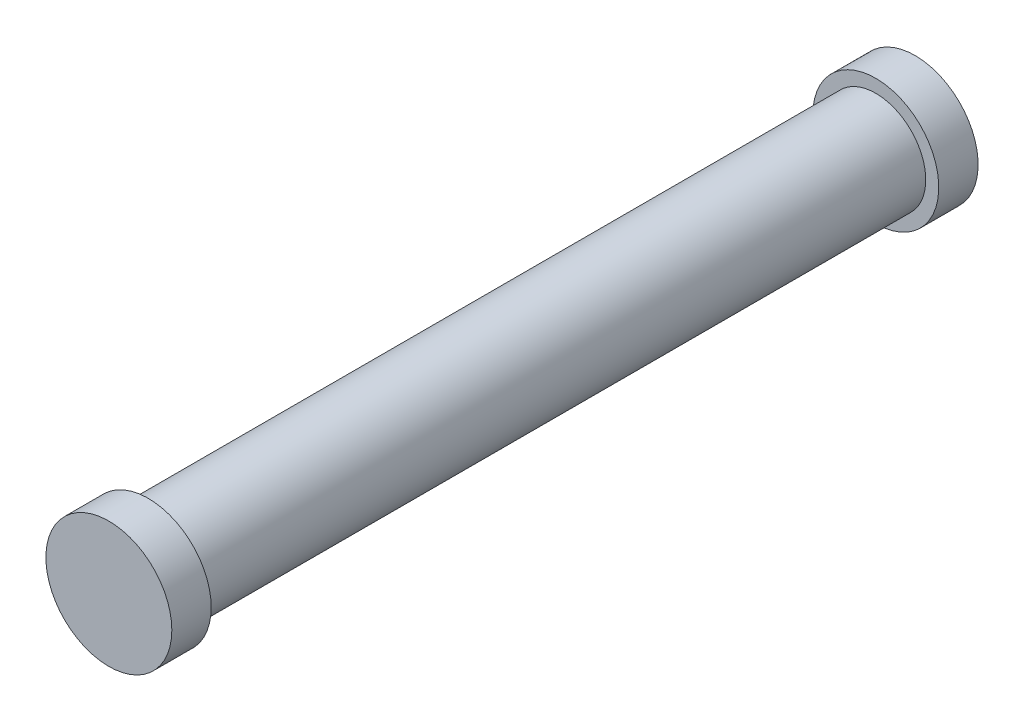
ISO-10303-21;
HEADER;
FILE_DESCRIPTION(('STEP AP214'),'2;1');
FILE_NAME('part.step','',(''),(''),'','','');
FILE_SCHEMA(('AUTOMOTIVE_DESIGN { 1 0 10303 214 1 1 1 1 }'));
ENDSEC;
DATA;
#1=APPLICATION_CONTEXT('core data for automotive mechanical design processes');
#2=APPLICATION_PROTOCOL_DEFINITION('international standard','automotive_design',2000,#1);
#3=PRODUCT_CONTEXT('',#1,'mechanical');
#4=PRODUCT('Part','Part','',(#3));
#5=PRODUCT_RELATED_PRODUCT_CATEGORY('part','',(#4));
#6=PRODUCT_DEFINITION_FORMATION('','',#4);
#7=PRODUCT_DEFINITION_CONTEXT('part definition',#1,'design');
#8=PRODUCT_DEFINITION('design','',#6,#7);
#9=PRODUCT_DEFINITION_SHAPE('','',#8);
#10=(LENGTH_UNIT() NAMED_UNIT(*) SI_UNIT(.MILLI.,.METRE.));
#11=(NAMED_UNIT(*) PLANE_ANGLE_UNIT() SI_UNIT($,.RADIAN.));
#12=(NAMED_UNIT(*) SI_UNIT($,.STERADIAN.) SOLID_ANGLE_UNIT());
#13=UNCERTAINTY_MEASURE_WITH_UNIT(LENGTH_MEASURE(1.E-05),#10,'distance_accuracy_value','');
#14=(GEOMETRIC_REPRESENTATION_CONTEXT(3) GLOBAL_UNCERTAINTY_ASSIGNED_CONTEXT((#13)) GLOBAL_UNIT_ASSIGNED_CONTEXT((#10,
#11,#12)) REPRESENTATION_CONTEXT('',''));
#15=CARTESIAN_POINT('',(0.,0.,0.));
#16=DIRECTION('',(0.,0.,1.));
#17=DIRECTION('',(1.,0.,0.));
#18=AXIS2_PLACEMENT_3D('',#15,#16,#17);
#19=CARTESIAN_POINT('',(0.,0.,138.63105676));
#20=DIRECTION('',(0.,0.,-1.));
#21=DIRECTION('',(-1.,0.,0.));
#22=AXIS2_PLACEMENT_3D('',#19,#20,#21);
#23=CYLINDRICAL_SURFACE('',#22,9.525);
#24=CARTESIAN_POINT('',(0.,0.,138.63105676));
#25=DIRECTION('',(0.,0.,1.));
#26=DIRECTION('',(1.,0.,0.));
#27=AXIS2_PLACEMENT_3D('',#24,#25,#26);
#28=CIRCLE('',#27,9.525);
#29=CARTESIAN_POINT('',(9.525,0.,138.63105676));
#30=VERTEX_POINT('',#29);
#31=EDGE_CURVE('E10',#30,#30,#28,.T.);
#32=ORIENTED_EDGE('',*,*,#31,.F.);
#33=EDGE_LOOP('',(#32));
#34=FACE_BOUND('',#33,.T.);
#35=CARTESIAN_POINT('',(0.,0.,0.));
#36=DIRECTION('',(0.,0.,-1.));
#37=DIRECTION('',(-1.,0.,0.));
#38=AXIS2_PLACEMENT_3D('',#35,#36,#37);
#39=CIRCLE('',#38,9.525);
#40=CARTESIAN_POINT('',(-9.525,0.,0.));
#41=VERTEX_POINT('',#40);
#42=EDGE_CURVE('E46',#41,#41,#39,.T.);
#43=ORIENTED_EDGE('',*,*,#42,.F.);
#44=EDGE_LOOP('',(#43));
#45=FACE_BOUND('',#44,.T.);
#46=ADVANCED_FACE('F31',(#34,#45),#23,.T.);
#47=CARTESIAN_POINT('',(0.,0.,138.63105676));
#48=DIRECTION('',(0.,0.,1.));
#49=DIRECTION('',(1.,0.,0.));
#50=AXIS2_PLACEMENT_3D('',#47,#48,#49);
#51=PLANE('',#50);
#52=CARTESIAN_POINT('',(0.,0.,138.63105676));
#53=DIRECTION('',(0.,0.,1.));
#54=DIRECTION('',(1.,0.,0.));
#55=AXIS2_PLACEMENT_3D('',#52,#53,#54);
#56=CIRCLE('',#55,12.);
#57=CARTESIAN_POINT('',(12.,0.,138.63105676));
#58=VERTEX_POINT('',#57);
#59=EDGE_CURVE('E41',#58,#58,#56,.T.);
#60=ORIENTED_EDGE('',*,*,#59,.F.);
#61=EDGE_LOOP('',(#60));
#62=FACE_BOUND('',#61,.T.);
#63=ORIENTED_EDGE('',*,*,#31,.T.);
#64=EDGE_LOOP('',(#63));
#65=FACE_BOUND('',#64,.T.);
#66=ADVANCED_FACE('F73',(#62,#65),#51,.F.);
#67=CARTESIAN_POINT('',(0.,0.,146.13105676));
#68=DIRECTION('',(0.,0.,-1.));
#69=DIRECTION('',(-1.,0.,0.));
#70=AXIS2_PLACEMENT_3D('',#67,#68,#69);
#71=CYLINDRICAL_SURFACE('',#70,12.);
#72=CARTESIAN_POINT('',(0.,0.,146.13105676));
#73=DIRECTION('',(0.,0.,1.));
#74=DIRECTION('',(1.,0.,0.));
#75=AXIS2_PLACEMENT_3D('',#72,#73,#74);
#76=CIRCLE('',#75,12.);
#77=CARTESIAN_POINT('',(12.,0.,146.13105676));
#78=VERTEX_POINT('',#77);
#79=EDGE_CURVE('E37',#78,#78,#76,.T.);
#80=ORIENTED_EDGE('',*,*,#79,.F.);
#81=EDGE_LOOP('',(#80));
#82=FACE_BOUND('',#81,.T.);
#83=ORIENTED_EDGE('',*,*,#59,.T.);
#84=EDGE_LOOP('',(#83));
#85=FACE_BOUND('',#84,.T.);
#86=ADVANCED_FACE('F78',(#82,#85),#71,.T.);
#87=CARTESIAN_POINT('',(0.,0.,146.13105676));
#88=DIRECTION('',(0.,0.,1.));
#89=DIRECTION('',(1.,0.,0.));
#90=AXIS2_PLACEMENT_3D('',#87,#88,#89);
#91=PLANE('',#90);
#92=ORIENTED_EDGE('',*,*,#79,.T.);
#93=EDGE_LOOP('',(#92));
#94=FACE_BOUND('',#93,.T.);
#95=ADVANCED_FACE('F68',(#94),#91,.T.);
#96=CARTESIAN_POINT('',(0.,0.,0.));
#97=DIRECTION('',(0.,0.,-1.));
#98=DIRECTION('',(-1.,0.,0.));
#99=AXIS2_PLACEMENT_3D('',#96,#97,#98);
#100=PLANE('',#99);
#101=CARTESIAN_POINT('',(0.,0.,0.));
#102=DIRECTION('',(0.,0.,-1.));
#103=DIRECTION('',(-1.,0.,0.));
#104=AXIS2_PLACEMENT_3D('',#101,#102,#103);
#105=CIRCLE('',#104,12.);
#106=CARTESIAN_POINT('',(-12.,0.,0.));
#107=VERTEX_POINT('',#106);
#108=EDGE_CURVE('E51',#107,#107,#105,.T.);
#109=ORIENTED_EDGE('',*,*,#108,.F.);
#110=EDGE_LOOP('',(#109));
#111=FACE_BOUND('',#110,.T.);
#112=ORIENTED_EDGE('',*,*,#42,.T.);
#113=EDGE_LOOP('',(#112));
#114=FACE_BOUND('',#113,.T.);
#115=ADVANCED_FACE('F62',(#111,#114),#100,.F.);
#116=CARTESIAN_POINT('',(0.,0.,-7.5));
#117=DIRECTION('',(0.,0.,1.));
#118=DIRECTION('',(1.,0.,0.));
#119=AXIS2_PLACEMENT_3D('',#116,#117,#118);
#120=CYLINDRICAL_SURFACE('',#119,12.);
#121=CARTESIAN_POINT('',(0.,0.,-7.5));
#122=DIRECTION('',(0.,0.,-1.));
#123=DIRECTION('',(-1.,0.,0.));
#124=AXIS2_PLACEMENT_3D('',#121,#122,#123);
#125=CIRCLE('',#124,12.);
#126=CARTESIAN_POINT('',(-12.,0.,-7.5));
#127=VERTEX_POINT('',#126);
#128=EDGE_CURVE('E50',#127,#127,#125,.T.);
#129=ORIENTED_EDGE('',*,*,#128,.F.);
#130=EDGE_LOOP('',(#129));
#131=FACE_BOUND('',#130,.T.);
#132=ORIENTED_EDGE('',*,*,#108,.T.);
#133=EDGE_LOOP('',(#132));
#134=FACE_BOUND('',#133,.T.);
#135=ADVANCED_FACE('F59',(#131,#134),#120,.T.);
#136=CARTESIAN_POINT('',(0.,0.,-7.5));
#137=DIRECTION('',(0.,0.,-1.));
#138=DIRECTION('',(-1.,0.,0.));
#139=AXIS2_PLACEMENT_3D('',#136,#137,#138);
#140=PLANE('',#139);
#141=ORIENTED_EDGE('',*,*,#128,.T.);
#142=EDGE_LOOP('',(#141));
#143=FACE_BOUND('',#142,.T.);
#144=ADVANCED_FACE('F57',(#143),#140,.T.);
#145=CLOSED_SHELL('',(#46,#66,#86,#95,#115,#135,#144));
#146=MANIFOLD_SOLID_BREP('B2',#145);
#147=ADVANCED_BREP_SHAPE_REPRESENTATION('',(#18,#146),#14);
#148=SHAPE_DEFINITION_REPRESENTATION(#9,#147);
ENDSEC;
END-ISO-10303-21;
